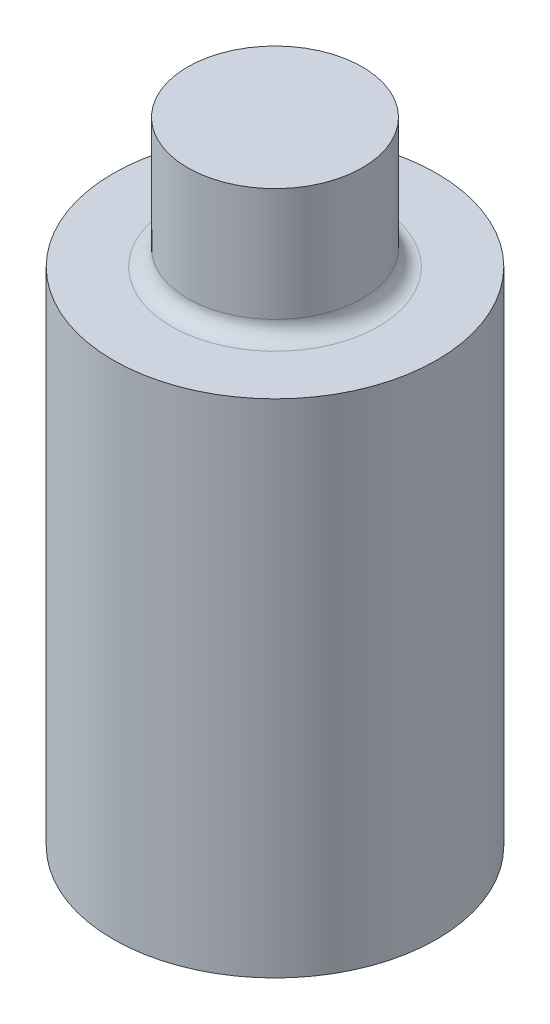
ISO-10303-21;
HEADER;
FILE_DESCRIPTION(('STEP AP214'),'2;1');
FILE_NAME('part.step','',(''),(''),'','','');
FILE_SCHEMA(('AUTOMOTIVE_DESIGN { 1 0 10303 214 1 1 1 1 }'));
ENDSEC;
DATA;
#1=APPLICATION_CONTEXT('core data for automotive mechanical design processes');
#2=APPLICATION_PROTOCOL_DEFINITION('international standard','automotive_design',2000,#1);
#3=PRODUCT_CONTEXT('',#1,'mechanical');
#4=PRODUCT('Part','Part','',(#3));
#5=PRODUCT_RELATED_PRODUCT_CATEGORY('part','',(#4));
#6=PRODUCT_DEFINITION_FORMATION('','',#4);
#7=PRODUCT_DEFINITION_CONTEXT('part definition',#1,'design');
#8=PRODUCT_DEFINITION('design','',#6,#7);
#9=PRODUCT_DEFINITION_SHAPE('','',#8);
#10=(LENGTH_UNIT() NAMED_UNIT(*) SI_UNIT(.MILLI.,.METRE.));
#11=(NAMED_UNIT(*) PLANE_ANGLE_UNIT() SI_UNIT($,.RADIAN.));
#12=(NAMED_UNIT(*) SI_UNIT($,.STERADIAN.) SOLID_ANGLE_UNIT());
#13=UNCERTAINTY_MEASURE_WITH_UNIT(LENGTH_MEASURE(1.E-05),#10,'distance_accuracy_value','');
#14=(GEOMETRIC_REPRESENTATION_CONTEXT(3) GLOBAL_UNCERTAINTY_ASSIGNED_CONTEXT((#13)) GLOBAL_UNIT_ASSIGNED_CONTEXT((#10,
#11,#12)) REPRESENTATION_CONTEXT('',''));
#15=CARTESIAN_POINT('',(0.,0.,0.));
#16=DIRECTION('',(0.,0.,1.));
#17=DIRECTION('',(1.,0.,0.));
#18=AXIS2_PLACEMENT_3D('',#15,#16,#17);
#19=CARTESIAN_POINT('',(0.,15.5,0.));
#20=DIRECTION('',(0.,-1.,0.));
#21=DIRECTION('',(0.,0.,-1.));
#22=AXIS2_PLACEMENT_3D('',#19,#20,#21);
#23=CYLINDRICAL_SURFACE('',#22,5.);
#24=CARTESIAN_POINT('',(0.,15.5,0.));
#25=DIRECTION('',(0.,1.,0.));
#26=DIRECTION('',(0.,0.,1.));
#27=AXIS2_PLACEMENT_3D('',#24,#25,#26);
#28=CIRCLE('',#27,5.);
#29=CARTESIAN_POINT('',(0.,15.5,5.));
#30=VERTEX_POINT('',#29);
#31=EDGE_CURVE('E42',#30,#30,#28,.T.);
#32=ORIENTED_EDGE('',*,*,#31,.F.);
#33=EDGE_LOOP('',(#32));
#34=FACE_BOUND('',#33,.T.);
#35=CARTESIAN_POINT('',(0.,0.,0.));
#36=DIRECTION('',(0.,1.,0.));
#37=DIRECTION('',(0.,0.,1.));
#38=AXIS2_PLACEMENT_3D('',#35,#36,#37);
#39=CIRCLE('',#38,5.);
#40=CARTESIAN_POINT('',(0.,0.,5.));
#41=VERTEX_POINT('',#40);
#42=EDGE_CURVE('E46',#41,#41,#39,.T.);
#43=ORIENTED_EDGE('',*,*,#42,.T.);
#44=EDGE_LOOP('',(#43));
#45=FACE_BOUND('',#44,.T.);
#46=ADVANCED_FACE('F31',(#34,#45),#23,.T.);
#47=CARTESIAN_POINT('',(0.,15.5,0.));
#48=DIRECTION('',(0.,1.,0.));
#49=DIRECTION('',(0.,0.,1.));
#50=AXIS2_PLACEMENT_3D('',#47,#48,#49);
#51=PLANE('',#50);
#52=CARTESIAN_POINT('',(0.,15.5,0.));
#53=DIRECTION('',(0.,1.,0.));
#54=DIRECTION('',(0.,0.,1.));
#55=AXIS2_PLACEMENT_3D('',#52,#53,#54);
#56=CIRCLE('',#55,3.2);
#57=CARTESIAN_POINT('',(0.,15.5,3.2));
#58=VERTEX_POINT('',#57);
#59=EDGE_CURVE('E10',#58,#58,#56,.F.);
#60=ORIENTED_EDGE('',*,*,#59,.T.);
#61=EDGE_LOOP('',(#60));
#62=FACE_BOUND('',#61,.T.);
#63=ORIENTED_EDGE('',*,*,#31,.T.);
#64=EDGE_LOOP('',(#63));
#65=FACE_BOUND('',#64,.T.);
#66=ADVANCED_FACE('F66',(#62,#65),#51,.T.);
#67=CARTESIAN_POINT('',(0.,0.,0.));
#68=DIRECTION('',(0.,1.,0.));
#69=DIRECTION('',(0.,0.,1.));
#70=AXIS2_PLACEMENT_3D('',#67,#68,#69);
#71=PLANE('',#70);
#72=ORIENTED_EDGE('',*,*,#42,.F.);
#73=EDGE_LOOP('',(#72));
#74=FACE_BOUND('',#73,.T.);
#75=ADVANCED_FACE('F59',(#74),#71,.F.);
#76=CARTESIAN_POINT('',(0.,19.5,0.));
#77=DIRECTION('',(0.,-1.,0.));
#78=DIRECTION('',(0.,0.,-1.));
#79=AXIS2_PLACEMENT_3D('',#76,#77,#78);
#80=CYLINDRICAL_SURFACE('',#79,2.7);
#81=CARTESIAN_POINT('',(0.,16.,0.));
#82=DIRECTION('',(0.,1.,0.));
#83=DIRECTION('',(0.,0.,1.));
#84=AXIS2_PLACEMENT_3D('',#81,#82,#83);
#85=CIRCLE('',#84,2.7);
#86=CARTESIAN_POINT('',(0.,16.,2.7));
#87=VERTEX_POINT('',#86);
#88=EDGE_CURVE('E38',#87,#87,#85,.T.);
#89=ORIENTED_EDGE('',*,*,#88,.T.);
#90=EDGE_LOOP('',(#89));
#91=FACE_BOUND('',#90,.T.);
#92=CARTESIAN_POINT('',(0.,19.5,0.));
#93=DIRECTION('',(0.,1.,0.));
#94=DIRECTION('',(0.,0.,1.));
#95=AXIS2_PLACEMENT_3D('',#92,#93,#94);
#96=CIRCLE('',#95,2.7);
#97=CARTESIAN_POINT('',(0.,19.5,2.7));
#98=VERTEX_POINT('',#97);
#99=EDGE_CURVE('E50',#98,#98,#96,.T.);
#100=ORIENTED_EDGE('',*,*,#99,.F.);
#101=EDGE_LOOP('',(#100));
#102=FACE_BOUND('',#101,.T.);
#103=ADVANCED_FACE('F57',(#91,#102),#80,.T.);
#104=CARTESIAN_POINT('',(0.,19.5,0.));
#105=DIRECTION('',(0.,1.,0.));
#106=DIRECTION('',(0.,0.,1.));
#107=AXIS2_PLACEMENT_3D('',#104,#105,#106);
#108=PLANE('',#107);
#109=ORIENTED_EDGE('',*,*,#99,.T.);
#110=EDGE_LOOP('',(#109));
#111=FACE_BOUND('',#110,.T.);
#112=ADVANCED_FACE('F55',(#111),#108,.T.);
#113=CARTESIAN_POINT('',(0.,16.,0.));
#114=DIRECTION('',(0.,1.,0.));
#115=DIRECTION('',(0.,0.,1.));
#116=AXIS2_PLACEMENT_3D('',#113,#114,#115);
#117=TOROIDAL_SURFACE('',#116,3.2,0.5);
#118=ORIENTED_EDGE('',*,*,#59,.F.);
#119=EDGE_LOOP('',(#118));
#120=FACE_BOUND('',#119,.T.);
#121=ORIENTED_EDGE('',*,*,#88,.F.);
#122=EDGE_LOOP('',(#121));
#123=FACE_BOUND('',#122,.T.);
#124=ADVANCED_FACE('F33',(#120,#123),#117,.F.);
#125=CLOSED_SHELL('',(#46,#66,#75,#103,#112,#124));
#126=MANIFOLD_SOLID_BREP('B2',#125);
#127=ADVANCED_BREP_SHAPE_REPRESENTATION('',(#18,#126),#14);
#128=SHAPE_DEFINITION_REPRESENTATION(#9,#127);
ENDSEC;
END-ISO-10303-21;
